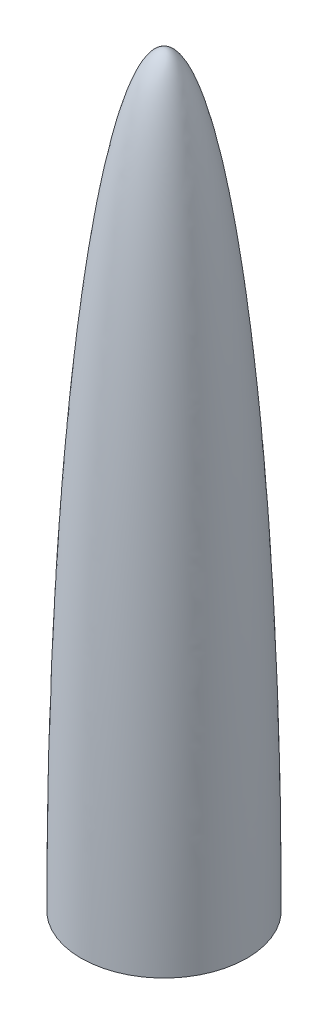
ISO-10303-21;
HEADER;
FILE_DESCRIPTION(('STEP AP214'),'2;1');
FILE_NAME('part.step','',(''),(''),'','','');
FILE_SCHEMA(('AUTOMOTIVE_DESIGN { 1 0 10303 214 1 1 1 1 }'));
ENDSEC;
DATA;
#1=APPLICATION_CONTEXT('core data for automotive mechanical design processes');
#2=APPLICATION_PROTOCOL_DEFINITION('international standard','automotive_design',2000,#1);
#3=PRODUCT_CONTEXT('',#1,'mechanical');
#4=PRODUCT('Part','Part','',(#3));
#5=PRODUCT_RELATED_PRODUCT_CATEGORY('part','',(#4));
#6=PRODUCT_DEFINITION_FORMATION('','',#4);
#7=PRODUCT_DEFINITION_CONTEXT('part definition',#1,'design');
#8=PRODUCT_DEFINITION('design','',#6,#7);
#9=PRODUCT_DEFINITION_SHAPE('','',#8);
#10=(LENGTH_UNIT() NAMED_UNIT(*) SI_UNIT(.MILLI.,.METRE.));
#11=(NAMED_UNIT(*) PLANE_ANGLE_UNIT() SI_UNIT($,.RADIAN.));
#12=(NAMED_UNIT(*) SI_UNIT($,.STERADIAN.) SOLID_ANGLE_UNIT());
#13=UNCERTAINTY_MEASURE_WITH_UNIT(LENGTH_MEASURE(1.E-05),#10,'distance_accuracy_value','');
#14=(GEOMETRIC_REPRESENTATION_CONTEXT(3) GLOBAL_UNCERTAINTY_ASSIGNED_CONTEXT((#13)) GLOBAL_UNIT_ASSIGNED_CONTEXT((#10,
#11,#12)) REPRESENTATION_CONTEXT('',''));
#15=CARTESIAN_POINT('',(0.,0.,0.));
#16=DIRECTION('',(0.,0.,1.));
#17=DIRECTION('',(1.,0.,0.));
#18=AXIS2_PLACEMENT_3D('',#15,#16,#17);
#19=CARTESIAN_POINT('',(0.,0.,0.));
#20=DIRECTION('',(-1.,0.,0.));
#21=DIRECTION('',(0.,1.,0.));
#22=AXIS2_PLACEMENT_3D('',#19,#20,#21);
#23=ELLIPSE('',#22,227.33,24.13);
#24=TRIMMED_CURVE('',#23,(PARAMETER_VALUE(0.)),(PARAMETER_VALUE(3.14159265358979)),.T.,.PARAMETER.);
#25=CARTESIAN_POINT('',(0.,0.,0.));
#26=DIRECTION('',(0.,-1.,0.));
#27=AXIS1_PLACEMENT('',#25,#26);
#28=SURFACE_OF_REVOLUTION('',#24,#27);
#29=CARTESIAN_POINT('',(0.,0.,0.));
#30=DIRECTION('',(0.,-1.,0.));
#31=DIRECTION('',(0.,0.,-1.));
#32=AXIS2_PLACEMENT_3D('',#29,#30,#31);
#33=CIRCLE('',#32,24.13);
#34=CARTESIAN_POINT('',(0.,0.,-24.13));
#35=VERTEX_POINT('',#34);
#36=EDGE_CURVE('E11',#35,#35,#33,.T.);
#37=ORIENTED_EDGE('',*,*,#36,.T.);
#38=EDGE_LOOP('',(#37));
#39=FACE_BOUND('',#38,.T.);
#40=CARTESIAN_POINT('',(0.,227.33,0.));
#41=VERTEX_POINT('',#40);
#42=VERTEX_LOOP('',#41);
#43=FACE_BOUND('',#42,.T.);
#44=ADVANCED_FACE('F33',(#39,#43),#28,.F.);
#45=CARTESIAN_POINT('',(0.,0.,-24.13));
#46=DIRECTION('',(0.,-1.,0.));
#47=DIRECTION('',(0.,0.,-1.));
#48=AXIS2_PLACEMENT_3D('',#45,#46,#47);
#49=PLANE('',#48);
#50=CARTESIAN_POINT('',(0.,0.,0.));
#51=DIRECTION('',(0.,-1.,0.));
#52=DIRECTION('',(0.,0.,-1.));
#53=AXIS2_PLACEMENT_3D('',#50,#51,#52);
#54=CIRCLE('',#53,25.4);
#55=CARTESIAN_POINT('',(0.,0.,-25.4));
#56=VERTEX_POINT('',#55);
#57=EDGE_CURVE('E41',#56,#56,#54,.T.);
#58=ORIENTED_EDGE('',*,*,#57,.T.);
#59=EDGE_LOOP('',(#58));
#60=FACE_BOUND('',#59,.T.);
#61=ORIENTED_EDGE('',*,*,#36,.F.);
#62=EDGE_LOOP('',(#61));
#63=FACE_BOUND('',#62,.T.);
#64=ADVANCED_FACE('F50',(#60,#63),#49,.T.);
#65=CARTESIAN_POINT('',(0.,0.,0.));
#66=DIRECTION('',(1.,0.,0.));
#67=DIRECTION('',(0.,1.,0.));
#68=AXIS2_PLACEMENT_3D('',#65,#66,#67);
#69=ELLIPSE('',#68,228.6,25.4);
#70=TRIMMED_CURVE('',#69,(PARAMETER_VALUE(3.14159265358979)),
(PARAMETER_VALUE(6.28318530717959)),.T.,.PARAMETER.);
#71=CARTESIAN_POINT('',(0.,0.,0.));
#72=DIRECTION('',(0.,-1.,0.));
#73=AXIS1_PLACEMENT('',#71,#72);
#74=SURFACE_OF_REVOLUTION('',#70,#73);
#75=CARTESIAN_POINT('',(0.,228.6,0.));
#76=VERTEX_POINT('',#75);
#77=VERTEX_LOOP('',#76);
#78=FACE_BOUND('',#77,.T.);
#79=ORIENTED_EDGE('',*,*,#57,.F.);
#80=EDGE_LOOP('',(#79));
#81=FACE_BOUND('',#80,.T.);
#82=ADVANCED_FACE('F47',(#78,#81),#74,.F.);
#83=CLOSED_SHELL('',(#44,#64,#82));
#84=MANIFOLD_SOLID_BREP('B2',#83);
#85=ADVANCED_BREP_SHAPE_REPRESENTATION('',(#18,#84),#14);
#86=SHAPE_DEFINITION_REPRESENTATION(#9,#85);
ENDSEC;
END-ISO-10303-21;
